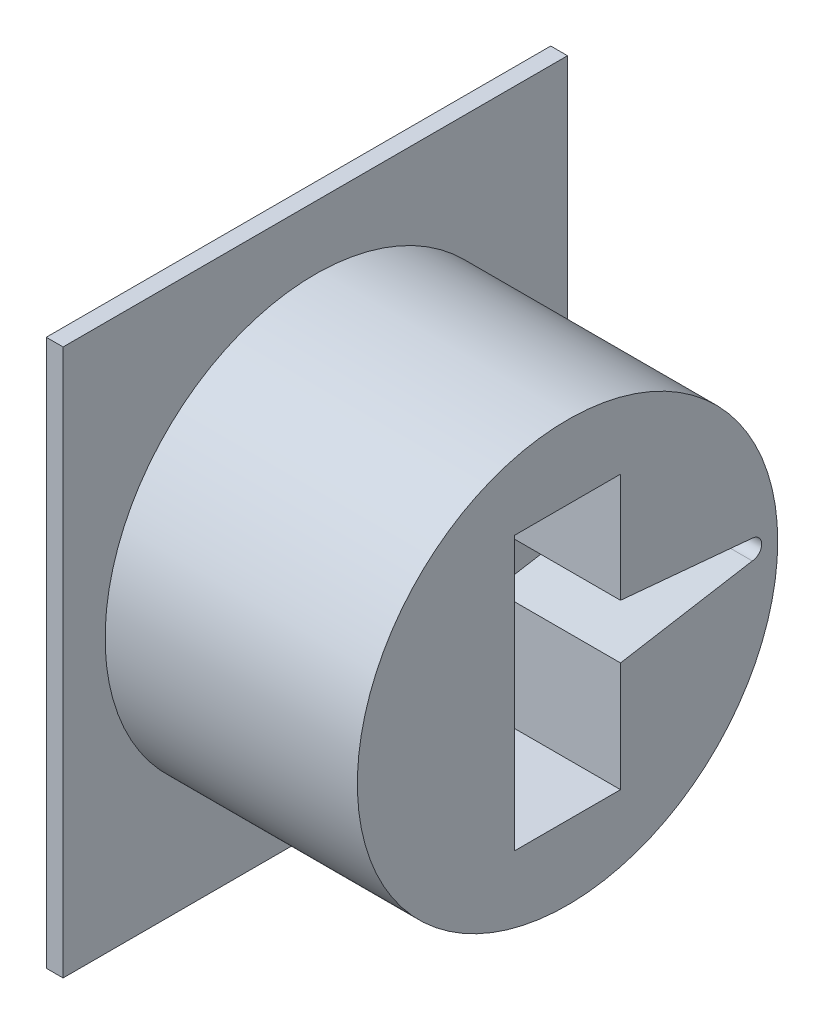
ISO-10303-21;
HEADER;
FILE_DESCRIPTION(('STEP AP214'),'2;1');
FILE_NAME('part.step','',(''),(''),'','','');
FILE_SCHEMA(('AUTOMOTIVE_DESIGN { 1 0 10303 214 1 1 1 1 }'));
ENDSEC;
DATA;
#1=APPLICATION_CONTEXT('core data for automotive mechanical design processes');
#2=APPLICATION_PROTOCOL_DEFINITION('international standard','automotive_design',2000,#1);
#3=PRODUCT_CONTEXT('',#1,'mechanical');
#4=PRODUCT('Part','Part','',(#3));
#5=PRODUCT_RELATED_PRODUCT_CATEGORY('part','',(#4));
#6=PRODUCT_DEFINITION_FORMATION('','',#4);
#7=PRODUCT_DEFINITION_CONTEXT('part definition',#1,'design');
#8=PRODUCT_DEFINITION('design','',#6,#7);
#9=PRODUCT_DEFINITION_SHAPE('','',#8);
#10=(LENGTH_UNIT() NAMED_UNIT(*) SI_UNIT(.MILLI.,.METRE.));
#11=(NAMED_UNIT(*) PLANE_ANGLE_UNIT() SI_UNIT($,.RADIAN.));
#12=(NAMED_UNIT(*) SI_UNIT($,.STERADIAN.) SOLID_ANGLE_UNIT());
#13=UNCERTAINTY_MEASURE_WITH_UNIT(LENGTH_MEASURE(1.E-05),#10,'distance_accuracy_value','');
#14=(GEOMETRIC_REPRESENTATION_CONTEXT(3) GLOBAL_UNCERTAINTY_ASSIGNED_CONTEXT((#13)) GLOBAL_UNIT_ASSIGNED_CONTEXT((#10,
#11,#12)) REPRESENTATION_CONTEXT('',''));
#15=CARTESIAN_POINT('',(0.,0.,0.));
#16=DIRECTION('',(0.,0.,1.));
#17=DIRECTION('',(1.,0.,0.));
#18=AXIS2_PLACEMENT_3D('',#15,#16,#17);
#19=CARTESIAN_POINT('',(30.,0.,0.));
#20=DIRECTION('',(-1.,0.,0.));
#21=DIRECTION('',(0.,0.,1.));
#22=AXIS2_PLACEMENT_3D('',#19,#20,#21);
#23=CYLINDRICAL_SURFACE('',#22,25.);
#24=CARTESIAN_POINT('',(30.,0.,0.));
#25=DIRECTION('',(1.,0.,0.));
#26=DIRECTION('',(0.,0.,-1.));
#27=AXIS2_PLACEMENT_3D('',#24,#25,#26);
#28=CIRCLE('',#27,25.);
#29=CARTESIAN_POINT('',(30.,0.,-25.));
#30=VERTEX_POINT('',#29);
#31=EDGE_CURVE('E11',#30,#30,#28,.T.);
#32=ORIENTED_EDGE('',*,*,#31,.F.);
#33=EDGE_LOOP('',(#32));
#34=FACE_BOUND('',#33,.T.);
#35=CARTESIAN_POINT('',(0.,0.,0.));
#36=DIRECTION('',(1.,0.,0.));
#37=DIRECTION('',(0.,0.,-1.));
#38=AXIS2_PLACEMENT_3D('',#35,#36,#37);
#39=CIRCLE('',#38,25.);
#40=CARTESIAN_POINT('',(0.,0.,-25.));
#41=VERTEX_POINT('',#40);
#42=EDGE_CURVE('E42',#41,#41,#39,.T.);
#43=ORIENTED_EDGE('',*,*,#42,.T.);
#44=EDGE_LOOP('',(#43));
#45=FACE_BOUND('',#44,.T.);
#46=ADVANCED_FACE('F39',(#34,#45),#23,.T.);
#47=CARTESIAN_POINT('',(30.,0.,0.));
#48=DIRECTION('',(1.,0.,0.));
#49=DIRECTION('',(0.,0.,-1.));
#50=AXIS2_PLACEMENT_3D('',#47,#48,#49);
#51=PLANE('',#50);
#52=DIRECTION('',(0.,1.,0.));
#53=VECTOR('',#52,1.);
#54=CARTESIAN_POINT('',(30.,3.25281732682682,-6.3));
#55=LINE('',#54,#53);
#56=CARTESIAN_POINT('',(30.,3.25281732682682,-6.3));
#57=VERTEX_POINT('',#56);
#58=CARTESIAN_POINT('',(30.,16.25,-6.3));
#59=VERTEX_POINT('',#58);
#60=EDGE_CURVE('E55',#57,#59,#55,.T.);
#61=ORIENTED_EDGE('',*,*,#60,.F.);
#62=DIRECTION('',(0.,0.0912181600477063,0.995830933079261));
#63=VECTOR('',#62,1.);
#64=CARTESIAN_POINT('',(30.,3.25281732682682,-6.3));
#65=LINE('',#64,#63);
#66=CARTESIAN_POINT('',(30.,1.81256529540316,-22.0232674236339));
#67=VERTEX_POINT('',#66);
#68=EDGE_CURVE('E171',#67,#57,#65,.T.);
#69=ORIENTED_EDGE('',*,*,#68,.F.);
#70=CARTESIAN_POINT('',(30.,0.643121555250039,-21.9161463223379));
#71=DIRECTION('',(1.,0.,0.));
#72=DIRECTION('',(0.,0.,1.));
#73=AXIS2_PLACEMENT_3D('',#70,#71,#72);
#74=CIRCLE('',#73,1.17433964070289);
#75=CARTESIAN_POINT('',(30.,-0.529723832367795,-21.9753686869459));
#76=VERTEX_POINT('',#75);
#77=EDGE_CURVE('E168',#76,#67,#74,.T.);
#78=ORIENTED_EDGE('',*,*,#77,.F.);
#79=DIRECTION('',(0.,0.167712002253808,-0.985836033171855));
#80=VECTOR('',#79,1.);
#81=CARTESIAN_POINT('',(30.,-3.19644261733237,-6.3));
#82=LINE('',#81,#80);
#83=CARTESIAN_POINT('',(30.,-3.19644261733237,-6.3));
#84=VERTEX_POINT('',#83);
#85=EDGE_CURVE('E118',#84,#76,#82,.T.);
#86=ORIENTED_EDGE('',*,*,#85,.F.);
#87=DIRECTION('',(0.,1.,0.));
#88=VECTOR('',#87,1.);
#89=CARTESIAN_POINT('',(30.,-16.25,-6.3));
#90=LINE('',#89,#88);
#91=CARTESIAN_POINT('',(30.,-16.25,-6.3));
#92=VERTEX_POINT('',#91);
#93=EDGE_CURVE('E162',#92,#84,#90,.T.);
#94=ORIENTED_EDGE('',*,*,#93,.F.);
#95=DIRECTION('',(0.,0.,-1.));
#96=VECTOR('',#95,1.);
#97=CARTESIAN_POINT('',(30.,-16.25,6.3));
#98=LINE('',#97,#96);
#99=CARTESIAN_POINT('',(30.,-16.25,6.3));
#100=VERTEX_POINT('',#99);
#101=EDGE_CURVE('E158',#100,#92,#98,.T.);
#102=ORIENTED_EDGE('',*,*,#101,.F.);
#103=DIRECTION('',(0.,-1.,0.));
#104=VECTOR('',#103,1.);
#105=CARTESIAN_POINT('',(30.,-16.25,6.3));
#106=LINE('',#105,#104);
#107=CARTESIAN_POINT('',(30.,16.25,6.3));
#108=VERTEX_POINT('',#107);
#109=EDGE_CURVE('E154',#108,#100,#106,.T.);
#110=ORIENTED_EDGE('',*,*,#109,.F.);
#111=DIRECTION('',(0.,0.,1.));
#112=VECTOR('',#111,1.);
#113=CARTESIAN_POINT('',(30.,16.25,6.3));
#114=LINE('',#113,#112);
#115=EDGE_CURVE('E150',#59,#108,#114,.T.);
#116=ORIENTED_EDGE('',*,*,#115,.F.);
#117=EDGE_LOOP('',(#61,#69,#78,#86,#94,#102,#110,#116));
#118=FACE_BOUND('',#117,.T.);
#119=ORIENTED_EDGE('',*,*,#31,.T.);
#120=EDGE_LOOP('',(#119));
#121=FACE_BOUND('',#120,.T.);
#122=ADVANCED_FACE('F198',(#118,#121),#51,.T.);
#123=CARTESIAN_POINT('',(15.,3.25281732682682,-6.3));
#124=DIRECTION('',(0.,0.,-1.));
#125=DIRECTION('',(-1.,0.,0.));
#126=AXIS2_PLACEMENT_3D('',#123,#124,#125);
#127=PLANE('',#126);
#128=ORIENTED_EDGE('',*,*,#60,.T.);
#129=DIRECTION('',(1.,0.,0.));
#130=VECTOR('',#129,1.);
#131=CARTESIAN_POINT('',(15.,16.25,-6.3));
#132=LINE('',#131,#130);
#133=CARTESIAN_POINT('',(15.,16.25,-6.3));
#134=VERTEX_POINT('',#133);
#135=EDGE_CURVE('E91',#134,#59,#132,.T.);
#136=ORIENTED_EDGE('',*,*,#135,.F.);
#137=DIRECTION('',(0.,1.,0.));
#138=VECTOR('',#137,1.);
#139=CARTESIAN_POINT('',(15.,3.25281732682682,-6.3));
#140=LINE('',#139,#138);
#141=CARTESIAN_POINT('',(15.,3.25281732682682,-6.3));
#142=VERTEX_POINT('',#141);
#143=EDGE_CURVE('E174',#142,#134,#140,.T.);
#144=ORIENTED_EDGE('',*,*,#143,.F.);
#145=DIRECTION('',(1.,0.,0.));
#146=VECTOR('',#145,1.);
#147=CARTESIAN_POINT('',(15.,3.25281732682682,-6.3));
#148=LINE('',#147,#146);
#149=EDGE_CURVE('E48',#142,#57,#148,.T.);
#150=ORIENTED_EDGE('',*,*,#149,.T.);
#151=EDGE_LOOP('',(#128,#136,#144,#150));
#152=FACE_BOUND('',#151,.T.);
#153=ADVANCED_FACE('F223',(#152),#127,.F.);
#154=CARTESIAN_POINT('',(15.,3.25281732682682,-6.3));
#155=DIRECTION('',(0.,0.995830933079261,-0.0912181600477063));
#156=DIRECTION('',(0.,0.0912181600477063,0.995830933079261));
#157=AXIS2_PLACEMENT_3D('',#154,#155,#156);
#158=PLANE('',#157);
#159=ORIENTED_EDGE('',*,*,#68,.T.);
#160=ORIENTED_EDGE('',*,*,#149,.F.);
#161=DIRECTION('',(0.,0.0912181600477063,0.995830933079261));
#162=VECTOR('',#161,1.);
#163=CARTESIAN_POINT('',(15.,3.25281732682682,-6.3));
#164=LINE('',#163,#162);
#165=CARTESIAN_POINT('',(15.,1.81256529540316,-22.0232674236339));
#166=VERTEX_POINT('',#165);
#167=EDGE_CURVE('E132',#166,#142,#164,.T.);
#168=ORIENTED_EDGE('',*,*,#167,.F.);
#169=DIRECTION('',(1.,0.,0.));
#170=VECTOR('',#169,1.);
#171=CARTESIAN_POINT('',(15.,1.81256529540316,-22.0232674236339));
#172=LINE('',#171,#170);
#173=EDGE_CURVE('E123',#166,#67,#172,.T.);
#174=ORIENTED_EDGE('',*,*,#173,.T.);
#175=EDGE_LOOP('',(#159,#160,#168,#174));
#176=FACE_BOUND('',#175,.T.);
#177=ADVANCED_FACE('F221',(#176),#158,.F.);
#178=CARTESIAN_POINT('',(15.,0.643121555250039,-21.9161463223379));
#179=DIRECTION('',(1.,0.,0.));
#180=DIRECTION('',(0.,0.,-1.));
#181=AXIS2_PLACEMENT_3D('',#178,#179,#180);
#182=CYLINDRICAL_SURFACE('',#181,1.17433964070289);
#183=ORIENTED_EDGE('',*,*,#77,.T.);
#184=ORIENTED_EDGE('',*,*,#173,.F.);
#185=CARTESIAN_POINT('',(15.,0.643121555250039,-21.9161463223379));
#186=DIRECTION('',(1.,0.,0.));
#187=DIRECTION('',(0.,0.,1.));
#188=AXIS2_PLACEMENT_3D('',#185,#186,#187);
#189=CIRCLE('',#188,1.17433964070289);
#190=CARTESIAN_POINT('',(15.,-0.529723832367795,-21.9753686869459));
#191=VERTEX_POINT('',#190);
#192=EDGE_CURVE('E127',#191,#166,#189,.T.);
#193=ORIENTED_EDGE('',*,*,#192,.F.);
#194=DIRECTION('',(1.,0.,0.));
#195=VECTOR('',#194,1.);
#196=CARTESIAN_POINT('',(15.,-0.529723832367795,-21.9753686869459));
#197=LINE('',#196,#195);
#198=EDGE_CURVE('E111',#191,#76,#197,.T.);
#199=ORIENTED_EDGE('',*,*,#198,.T.);
#200=EDGE_LOOP('',(#183,#184,#193,#199));
#201=FACE_BOUND('',#200,.T.);
#202=ADVANCED_FACE('F128',(#201),#182,.F.);
#203=CARTESIAN_POINT('',(15.,-3.19644261733237,-6.3));
#204=DIRECTION('',(0.,-0.985836033171855,-0.167712002253808));
#205=DIRECTION('',(0.,0.167712002253808,-0.985836033171855));
#206=AXIS2_PLACEMENT_3D('',#203,#204,#205);
#207=PLANE('',#206);
#208=ORIENTED_EDGE('',*,*,#85,.T.);
#209=ORIENTED_EDGE('',*,*,#198,.F.);
#210=DIRECTION('',(0.,0.167712002253808,-0.985836033171855));
#211=VECTOR('',#210,1.);
#212=CARTESIAN_POINT('',(15.,-3.19644261733237,-6.3));
#213=LINE('',#212,#211);
#214=CARTESIAN_POINT('',(15.,-3.19644261733237,-6.3));
#215=VERTEX_POINT('',#214);
#216=EDGE_CURVE('E115',#215,#191,#213,.T.);
#217=ORIENTED_EDGE('',*,*,#216,.F.);
#218=DIRECTION('',(1.,0.,0.));
#219=VECTOR('',#218,1.);
#220=CARTESIAN_POINT('',(15.,-3.19644261733237,-6.3));
#221=LINE('',#220,#219);
#222=EDGE_CURVE('E124',#215,#84,#221,.T.);
#223=ORIENTED_EDGE('',*,*,#222,.T.);
#224=EDGE_LOOP('',(#208,#209,#217,#223));
#225=FACE_BOUND('',#224,.T.);
#226=ADVANCED_FACE('F113',(#225),#207,.F.);
#227=CARTESIAN_POINT('',(15.,-16.25,-6.3));
#228=DIRECTION('',(0.,0.,-1.));
#229=DIRECTION('',(-1.,0.,0.));
#230=AXIS2_PLACEMENT_3D('',#227,#228,#229);
#231=PLANE('',#230);
#232=ORIENTED_EDGE('',*,*,#93,.T.);
#233=ORIENTED_EDGE('',*,*,#222,.F.);
#234=DIRECTION('',(0.,1.,0.));
#235=VECTOR('',#234,1.);
#236=CARTESIAN_POINT('',(15.,-16.25,-6.3));
#237=LINE('',#236,#235);
#238=CARTESIAN_POINT('',(15.,-16.25,-6.3));
#239=VERTEX_POINT('',#238);
#240=EDGE_CURVE('E138',#239,#215,#237,.T.);
#241=ORIENTED_EDGE('',*,*,#240,.F.);
#242=DIRECTION('',(1.,0.,0.));
#243=VECTOR('',#242,1.);
#244=CARTESIAN_POINT('',(15.,-16.25,-6.3));
#245=LINE('',#244,#243);
#246=EDGE_CURVE('E181',#239,#92,#245,.T.);
#247=ORIENTED_EDGE('',*,*,#246,.T.);
#248=EDGE_LOOP('',(#232,#233,#241,#247));
#249=FACE_BOUND('',#248,.T.);
#250=ADVANCED_FACE('F220',(#249),#231,.F.);
#251=CARTESIAN_POINT('',(15.,-16.25,6.3));
#252=DIRECTION('',(0.,-1.,0.));
#253=DIRECTION('',(0.,0.,-1.));
#254=AXIS2_PLACEMENT_3D('',#251,#252,#253);
#255=PLANE('',#254);
#256=ORIENTED_EDGE('',*,*,#101,.T.);
#257=ORIENTED_EDGE('',*,*,#246,.F.);
#258=DIRECTION('',(0.,0.,-1.));
#259=VECTOR('',#258,1.);
#260=CARTESIAN_POINT('',(15.,-16.25,6.3));
#261=LINE('',#260,#259);
#262=CARTESIAN_POINT('',(15.,-16.25,6.3));
#263=VERTEX_POINT('',#262);
#264=EDGE_CURVE('E142',#263,#239,#261,.T.);
#265=ORIENTED_EDGE('',*,*,#264,.F.);
#266=DIRECTION('',(1.,0.,0.));
#267=VECTOR('',#266,1.);
#268=CARTESIAN_POINT('',(15.,-16.25,6.3));
#269=LINE('',#268,#267);
#270=EDGE_CURVE('E184',#263,#100,#269,.T.);
#271=ORIENTED_EDGE('',*,*,#270,.T.);
#272=EDGE_LOOP('',(#256,#257,#265,#271));
#273=FACE_BOUND('',#272,.T.);
#274=ADVANCED_FACE('F218',(#273),#255,.F.);
#275=CARTESIAN_POINT('',(15.,-16.25,6.3));
#276=DIRECTION('',(0.,0.,1.));
#277=DIRECTION('',(1.,0.,0.));
#278=AXIS2_PLACEMENT_3D('',#275,#276,#277);
#279=PLANE('',#278);
#280=ORIENTED_EDGE('',*,*,#109,.T.);
#281=ORIENTED_EDGE('',*,*,#270,.F.);
#282=DIRECTION('',(0.,-1.,0.));
#283=VECTOR('',#282,1.);
#284=CARTESIAN_POINT('',(15.,-16.25,6.3));
#285=LINE('',#284,#283);
#286=CARTESIAN_POINT('',(15.,16.25,6.3));
#287=VERTEX_POINT('',#286);
#288=EDGE_CURVE('E208',#287,#263,#285,.T.);
#289=ORIENTED_EDGE('',*,*,#288,.F.);
#290=DIRECTION('',(1.,0.,0.));
#291=VECTOR('',#290,1.);
#292=CARTESIAN_POINT('',(15.,16.25,6.3));
#293=LINE('',#292,#291);
#294=EDGE_CURVE('E187',#287,#108,#293,.T.);
#295=ORIENTED_EDGE('',*,*,#294,.T.);
#296=EDGE_LOOP('',(#280,#281,#289,#295));
#297=FACE_BOUND('',#296,.T.);
#298=ADVANCED_FACE('F204',(#297),#279,.F.);
#299=CARTESIAN_POINT('',(15.,16.25,6.3));
#300=DIRECTION('',(0.,1.,0.));
#301=DIRECTION('',(0.,0.,1.));
#302=AXIS2_PLACEMENT_3D('',#299,#300,#301);
#303=PLANE('',#302);
#304=ORIENTED_EDGE('',*,*,#115,.T.);
#305=ORIENTED_EDGE('',*,*,#294,.F.);
#306=DIRECTION('',(0.,0.,1.));
#307=VECTOR('',#306,1.);
#308=CARTESIAN_POINT('',(15.,16.25,6.3));
#309=LINE('',#308,#307);
#310=EDGE_CURVE('E196',#134,#287,#309,.T.);
#311=ORIENTED_EDGE('',*,*,#310,.F.);
#312=ORIENTED_EDGE('',*,*,#135,.T.);
#313=EDGE_LOOP('',(#304,#305,#311,#312));
#314=FACE_BOUND('',#313,.T.);
#315=ADVANCED_FACE('F193',(#314),#303,.F.);
#316=CARTESIAN_POINT('',(15.,0.643121555250039,-21.9161463223379));
#317=DIRECTION('',(-1.,0.,0.));
#318=DIRECTION('',(0.,0.,1.));
#319=AXIS2_PLACEMENT_3D('',#316,#317,#318);
#320=PLANE('',#319);
#321=ORIENTED_EDGE('',*,*,#143,.T.);
#322=ORIENTED_EDGE('',*,*,#310,.T.);
#323=ORIENTED_EDGE('',*,*,#288,.T.);
#324=ORIENTED_EDGE('',*,*,#264,.T.);
#325=ORIENTED_EDGE('',*,*,#240,.T.);
#326=ORIENTED_EDGE('',*,*,#216,.T.);
#327=ORIENTED_EDGE('',*,*,#192,.T.);
#328=ORIENTED_EDGE('',*,*,#167,.T.);
#329=EDGE_LOOP('',(#321,#322,#323,#324,#325,#326,#327,#328));
#330=FACE_BOUND('',#329,.T.);
#331=ADVANCED_FACE('F135',(#330),#320,.F.);
#332=CARTESIAN_POINT('',(-2.,-32.5,30.));
#333=DIRECTION('',(0.,0.,-1.));
#334=DIRECTION('',(-1.,0.,0.));
#335=AXIS2_PLACEMENT_3D('',#332,#333,#334);
#336=PLANE('',#335);
#337=DIRECTION('',(0.,1.,0.));
#338=VECTOR('',#337,1.);
#339=CARTESIAN_POINT('',(0.,-32.5,30.));
#340=LINE('',#339,#338);
#341=CARTESIAN_POINT('',(0.,-32.5,30.));
#342=VERTEX_POINT('',#341);
#343=CARTESIAN_POINT('',(0.,32.5,30.));
#344=VERTEX_POINT('',#343);
#345=EDGE_CURVE('E278',#342,#344,#340,.T.);
#346=ORIENTED_EDGE('',*,*,#345,.T.);
#347=DIRECTION('',(1.,0.,0.));
#348=VECTOR('',#347,1.);
#349=CARTESIAN_POINT('',(-2.,32.5,30.));
#350=LINE('',#349,#348);
#351=CARTESIAN_POINT('',(-2.,32.5,30.));
#352=VERTEX_POINT('',#351);
#353=EDGE_CURVE('E243',#352,#344,#350,.T.);
#354=ORIENTED_EDGE('',*,*,#353,.F.);
#355=DIRECTION('',(0.,1.,0.));
#356=VECTOR('',#355,1.);
#357=CARTESIAN_POINT('',(-2.,-32.5,30.));
#358=LINE('',#357,#356);
#359=CARTESIAN_POINT('',(-2.,-32.5,30.));
#360=VERTEX_POINT('',#359);
#361=EDGE_CURVE('E270',#360,#352,#358,.T.);
#362=ORIENTED_EDGE('',*,*,#361,.F.);
#363=DIRECTION('',(1.,0.,0.));
#364=VECTOR('',#363,1.);
#365=CARTESIAN_POINT('',(-2.,-32.5,30.));
#366=LINE('',#365,#364);
#367=EDGE_CURVE('E261',#360,#342,#366,.T.);
#368=ORIENTED_EDGE('',*,*,#367,.T.);
#369=EDGE_LOOP('',(#346,#354,#362,#368));
#370=FACE_BOUND('',#369,.T.);
#371=ADVANCED_FACE('F304',(#370),#336,.F.);
#372=CARTESIAN_POINT('',(-2.,32.5,-30.));
#373=DIRECTION('',(0.,-1.,0.));
#374=DIRECTION('',(0.,0.,-1.));
#375=AXIS2_PLACEMENT_3D('',#372,#373,#374);
#376=PLANE('',#375);
#377=DIRECTION('',(0.,0.,-1.));
#378=VECTOR('',#377,1.);
#379=CARTESIAN_POINT('',(0.,32.5,-30.));
#380=LINE('',#379,#378);
#381=CARTESIAN_POINT('',(0.,32.5,-30.));
#382=VERTEX_POINT('',#381);
#383=EDGE_CURVE('E275',#344,#382,#380,.T.);
#384=ORIENTED_EDGE('',*,*,#383,.T.);
#385=DIRECTION('',(1.,0.,0.));
#386=VECTOR('',#385,1.);
#387=CARTESIAN_POINT('',(-2.,32.5,-30.));
#388=LINE('',#387,#386);
#389=CARTESIAN_POINT('',(-2.,32.5,-30.));
#390=VERTEX_POINT('',#389);
#391=EDGE_CURVE('E246',#390,#382,#388,.T.);
#392=ORIENTED_EDGE('',*,*,#391,.F.);
#393=DIRECTION('',(0.,0.,-1.));
#394=VECTOR('',#393,1.);
#395=CARTESIAN_POINT('',(-2.,32.5,-30.));
#396=LINE('',#395,#394);
#397=EDGE_CURVE('E288',#352,#390,#396,.T.);
#398=ORIENTED_EDGE('',*,*,#397,.F.);
#399=ORIENTED_EDGE('',*,*,#353,.T.);
#400=EDGE_LOOP('',(#384,#392,#398,#399));
#401=FACE_BOUND('',#400,.T.);
#402=ADVANCED_FACE('F332',(#401),#376,.F.);
#403=CARTESIAN_POINT('',(-2.,-32.5,-30.));
#404=DIRECTION('',(0.,0.,1.));
#405=DIRECTION('',(1.,0.,0.));
#406=AXIS2_PLACEMENT_3D('',#403,#404,#405);
#407=PLANE('',#406);
#408=DIRECTION('',(0.,-1.,0.));
#409=VECTOR('',#408,1.);
#410=CARTESIAN_POINT('',(0.,-32.5,-30.));
#411=LINE('',#410,#409);
#412=CARTESIAN_POINT('',(0.,-32.5,-30.));
#413=VERTEX_POINT('',#412);
#414=EDGE_CURVE('E271',#382,#413,#411,.T.);
#415=ORIENTED_EDGE('',*,*,#414,.T.);
#416=DIRECTION('',(1.,0.,0.));
#417=VECTOR('',#416,1.);
#418=CARTESIAN_POINT('',(-2.,-32.5,-30.));
#419=LINE('',#418,#417);
#420=CARTESIAN_POINT('',(-2.,-32.5,-30.));
#421=VERTEX_POINT('',#420);
#422=EDGE_CURVE('E255',#421,#413,#419,.T.);
#423=ORIENTED_EDGE('',*,*,#422,.F.);
#424=DIRECTION('',(0.,-1.,0.));
#425=VECTOR('',#424,1.);
#426=CARTESIAN_POINT('',(-2.,-32.5,-30.));
#427=LINE('',#426,#425);
#428=EDGE_CURVE('E284',#390,#421,#427,.T.);
#429=ORIENTED_EDGE('',*,*,#428,.F.);
#430=ORIENTED_EDGE('',*,*,#391,.T.);
#431=EDGE_LOOP('',(#415,#423,#429,#430));
#432=FACE_BOUND('',#431,.T.);
#433=ADVANCED_FACE('F323',(#432),#407,.F.);
#434=CARTESIAN_POINT('',(-2.,-32.5,-30.));
#435=DIRECTION('',(0.,1.,0.));
#436=DIRECTION('',(0.,0.,1.));
#437=AXIS2_PLACEMENT_3D('',#434,#435,#436);
#438=PLANE('',#437);
#439=DIRECTION('',(0.,0.,1.));
#440=VECTOR('',#439,1.);
#441=CARTESIAN_POINT('',(0.,-32.5,-30.));
#442=LINE('',#441,#440);
#443=EDGE_CURVE('E266',#413,#342,#442,.T.);
#444=ORIENTED_EDGE('',*,*,#443,.T.);
#445=ORIENTED_EDGE('',*,*,#367,.F.);
#446=DIRECTION('',(0.,0.,1.));
#447=VECTOR('',#446,1.);
#448=CARTESIAN_POINT('',(-2.,-32.5,-30.));
#449=LINE('',#448,#447);
#450=EDGE_CURVE('E265',#421,#360,#449,.T.);
#451=ORIENTED_EDGE('',*,*,#450,.F.);
#452=ORIENTED_EDGE('',*,*,#422,.T.);
#453=EDGE_LOOP('',(#444,#445,#451,#452));
#454=FACE_BOUND('',#453,.T.);
#455=ADVANCED_FACE('F324',(#454),#438,.F.);
#456=CARTESIAN_POINT('',(-2.,0.,0.));
#457=DIRECTION('',(1.,0.,0.));
#458=DIRECTION('',(0.,0.,-1.));
#459=AXIS2_PLACEMENT_3D('',#456,#457,#458);
#460=PLANE('',#459);
#461=ORIENTED_EDGE('',*,*,#361,.T.);
#462=ORIENTED_EDGE('',*,*,#397,.T.);
#463=ORIENTED_EDGE('',*,*,#428,.T.);
#464=ORIENTED_EDGE('',*,*,#450,.T.);
#465=EDGE_LOOP('',(#461,#462,#463,#464));
#466=FACE_BOUND('',#465,.T.);
#467=ADVANCED_FACE('F297',(#466),#460,.F.);
#468=CARTESIAN_POINT('',(0.,0.,0.));
#469=DIRECTION('',(1.,0.,0.));
#470=DIRECTION('',(0.,0.,-1.));
#471=AXIS2_PLACEMENT_3D('',#468,#469,#470);
#472=PLANE('',#471);
#473=ORIENTED_EDGE('',*,*,#42,.F.);
#474=EDGE_LOOP('',(#473));
#475=FACE_BOUND('',#474,.T.);
#476=ORIENTED_EDGE('',*,*,#345,.F.);
#477=ORIENTED_EDGE('',*,*,#443,.F.);
#478=ORIENTED_EDGE('',*,*,#414,.F.);
#479=ORIENTED_EDGE('',*,*,#383,.F.);
#480=EDGE_LOOP('',(#476,#477,#478,#479));
#481=FACE_BOUND('',#480,.T.);
#482=ADVANCED_FACE('F311',(#475,#481),#472,.T.);
#483=CLOSED_SHELL('',(#46,#122,#153,#177,#202,#226,#250,#274,#298,#315,#331,#371,#402,#433,#455,
#467,#482));
#484=MANIFOLD_SOLID_BREP('B2',#483);
#485=ADVANCED_BREP_SHAPE_REPRESENTATION('',(#18,#484),#14);
#486=SHAPE_DEFINITION_REPRESENTATION(#9,#485);
ENDSEC;
END-ISO-10303-21;
